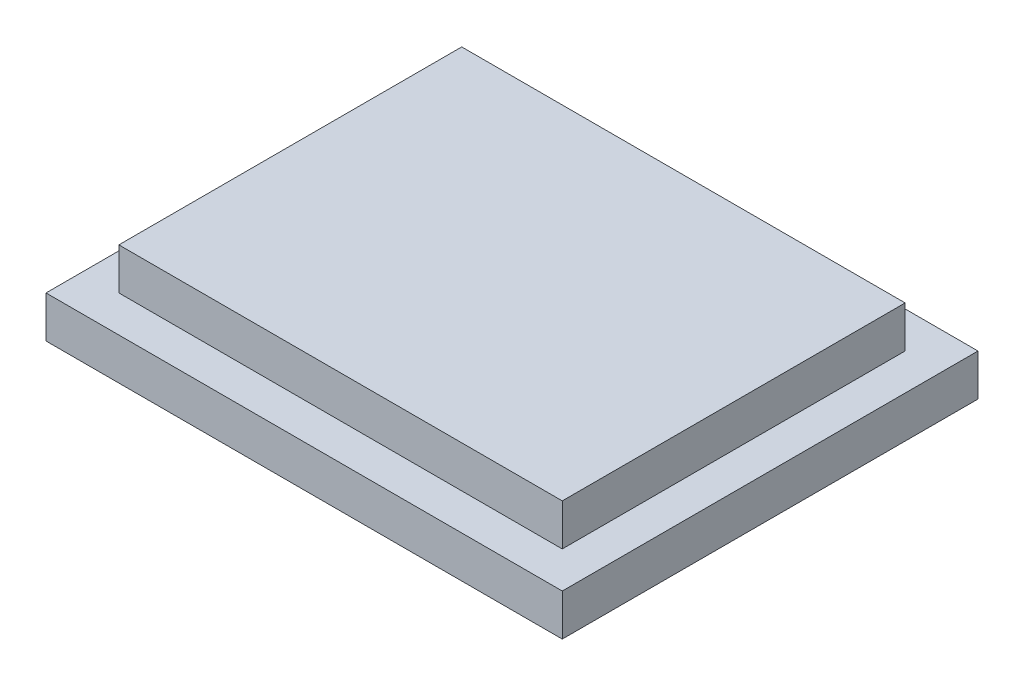
ISO-10303-21;
HEADER;
FILE_DESCRIPTION(('STEP AP214'),'2;1');
FILE_NAME('part.step','',(''),(''),'','','');
FILE_SCHEMA(('AUTOMOTIVE_DESIGN { 1 0 10303 214 1 1 1 1 }'));
ENDSEC;
DATA;
#1=APPLICATION_CONTEXT('core data for automotive mechanical design processes');
#2=APPLICATION_PROTOCOL_DEFINITION('international standard','automotive_design',2000,#1);
#3=PRODUCT_CONTEXT('',#1,'mechanical');
#4=PRODUCT('Part','Part','',(#3));
#5=PRODUCT_RELATED_PRODUCT_CATEGORY('part','',(#4));
#6=PRODUCT_DEFINITION_FORMATION('','',#4);
#7=PRODUCT_DEFINITION_CONTEXT('part definition',#1,'design');
#8=PRODUCT_DEFINITION('design','',#6,#7);
#9=PRODUCT_DEFINITION_SHAPE('','',#8);
#10=(LENGTH_UNIT() NAMED_UNIT(*) SI_UNIT(.MILLI.,.METRE.));
#11=(NAMED_UNIT(*) PLANE_ANGLE_UNIT() SI_UNIT($,.RADIAN.));
#12=(NAMED_UNIT(*) SI_UNIT($,.STERADIAN.) SOLID_ANGLE_UNIT());
#13=UNCERTAINTY_MEASURE_WITH_UNIT(LENGTH_MEASURE(1.E-05),#10,'distance_accuracy_value','');
#14=(GEOMETRIC_REPRESENTATION_CONTEXT(3) GLOBAL_UNCERTAINTY_ASSIGNED_CONTEXT((#13)) GLOBAL_UNIT_ASSIGNED_CONTEXT((#10,
#11,#12)) REPRESENTATION_CONTEXT('',''));
#15=CARTESIAN_POINT('',(0.,0.,0.));
#16=DIRECTION('',(0.,0.,1.));
#17=DIRECTION('',(1.,0.,0.));
#18=AXIS2_PLACEMENT_3D('',#15,#16,#17);
#19=CARTESIAN_POINT('',(0.,2.,0.));
#20=DIRECTION('',(0.,-1.,0.));
#21=DIRECTION('',(0.,0.,-1.));
#22=AXIS2_PLACEMENT_3D('',#19,#20,#21);
#23=PLANE('',#22);
#24=DIRECTION('',(0.,0.,1.));
#25=VECTOR('',#24,1.);
#26=CARTESIAN_POINT('',(0.,2.,0.));
#27=LINE('',#26,#25);
#28=CARTESIAN_POINT('',(0.,2.,-19.97));
#29=VERTEX_POINT('',#28);
#30=CARTESIAN_POINT('',(0.,2.,0.));
#31=VERTEX_POINT('',#30);
#32=EDGE_CURVE('E144',#29,#31,#27,.T.);
#33=ORIENTED_EDGE('',*,*,#32,.T.);
#34=DIRECTION('',(1.,0.,0.));
#35=VECTOR('',#34,1.);
#36=CARTESIAN_POINT('',(0.,2.,0.));
#37=LINE('',#36,#35);
#38=CARTESIAN_POINT('',(24.8,2.,0.));
#39=VERTEX_POINT('',#38);
#40=EDGE_CURVE('E146',#31,#39,#37,.T.);
#41=ORIENTED_EDGE('',*,*,#40,.T.);
#42=DIRECTION('',(0.,0.,-1.));
#43=VECTOR('',#42,1.);
#44=CARTESIAN_POINT('',(24.8,2.,0.));
#45=LINE('',#44,#43);
#46=CARTESIAN_POINT('',(24.8,2.,-19.97));
#47=VERTEX_POINT('',#46);
#48=EDGE_CURVE('E151',#39,#47,#45,.T.);
#49=ORIENTED_EDGE('',*,*,#48,.T.);
#50=DIRECTION('',(-1.,0.,0.));
#51=VECTOR('',#50,1.);
#52=CARTESIAN_POINT('',(0.,2.,-19.97));
#53=LINE('',#52,#51);
#54=EDGE_CURVE('E157',#47,#29,#53,.T.);
#55=ORIENTED_EDGE('',*,*,#54,.T.);
#56=EDGE_LOOP('',(#33,#41,#49,#55));
#57=FACE_BOUND('',#56,.T.);
#58=DIRECTION('',(-1.,0.,0.));
#59=VECTOR('',#58,1.);
#60=CARTESIAN_POINT('',(23.05,2.,-18.22));
#61=LINE('',#60,#59);
#62=CARTESIAN_POINT('',(23.05,2.,-18.22));
#63=VERTEX_POINT('',#62);
#64=CARTESIAN_POINT('',(1.75,2.,-18.22));
#65=VERTEX_POINT('',#64);
#66=EDGE_CURVE('E63',#63,#65,#61,.T.);
#67=ORIENTED_EDGE('',*,*,#66,.F.);
#68=DIRECTION('',(0.,0.,-1.));
#69=VECTOR('',#68,1.);
#70=CARTESIAN_POINT('',(23.05,2.,-1.75));
#71=LINE('',#70,#69);
#72=CARTESIAN_POINT('',(23.05,2.,-1.75));
#73=VERTEX_POINT('',#72);
#74=EDGE_CURVE('E64',#73,#63,#71,.T.);
#75=ORIENTED_EDGE('',*,*,#74,.F.);
#76=DIRECTION('',(1.,0.,0.));
#77=VECTOR('',#76,1.);
#78=CARTESIAN_POINT('',(1.75,2.,-1.75));
#79=LINE('',#78,#77);
#80=CARTESIAN_POINT('',(1.75,2.,-1.75));
#81=VERTEX_POINT('',#80);
#82=EDGE_CURVE('E272',#81,#73,#79,.T.);
#83=ORIENTED_EDGE('',*,*,#82,.F.);
#84=DIRECTION('',(0.,0.,1.));
#85=VECTOR('',#84,1.);
#86=CARTESIAN_POINT('',(1.75,2.,-18.22));
#87=LINE('',#86,#85);
#88=EDGE_CURVE('E281',#65,#81,#87,.T.);
#89=ORIENTED_EDGE('',*,*,#88,.F.);
#90=EDGE_LOOP('',(#67,#75,#83,#89));
#91=FACE_BOUND('',#90,.T.);
#92=ADVANCED_FACE('F44',(#57,#91),#23,.F.);
#93=CARTESIAN_POINT('',(0.,2.,0.));
#94=DIRECTION('',(1.,0.,0.));
#95=DIRECTION('',(0.,0.,-1.));
#96=AXIS2_PLACEMENT_3D('',#93,#94,#95);
#97=PLANE('',#96);
#98=DIRECTION('',(0.,0.,1.));
#99=VECTOR('',#98,1.);
#100=CARTESIAN_POINT('',(0.,0.,0.));
#101=LINE('',#100,#99);
#102=CARTESIAN_POINT('',(0.,0.,-19.97));
#103=VERTEX_POINT('',#102);
#104=CARTESIAN_POINT('',(0.,0.,0.));
#105=VERTEX_POINT('',#104);
#106=EDGE_CURVE('E132',#103,#105,#101,.T.);
#107=ORIENTED_EDGE('',*,*,#106,.T.);
#108=DIRECTION('',(0.,-1.,0.));
#109=VECTOR('',#108,1.);
#110=CARTESIAN_POINT('',(0.,2.,0.));
#111=LINE('',#110,#109);
#112=EDGE_CURVE('E11',#31,#105,#111,.T.);
#113=ORIENTED_EDGE('',*,*,#112,.F.);
#114=ORIENTED_EDGE('',*,*,#32,.F.);
#115=DIRECTION('',(0.,-1.,0.));
#116=VECTOR('',#115,1.);
#117=CARTESIAN_POINT('',(0.,2.,-19.97));
#118=LINE('',#117,#116);
#119=EDGE_CURVE('E156',#29,#103,#118,.T.);
#120=ORIENTED_EDGE('',*,*,#119,.T.);
#121=EDGE_LOOP('',(#107,#113,#114,#120));
#122=FACE_BOUND('',#121,.T.);
#123=ADVANCED_FACE('F50',(#122),#97,.F.);
#124=CARTESIAN_POINT('',(0.,2.,0.));
#125=DIRECTION('',(0.,0.,-1.));
#126=DIRECTION('',(-1.,0.,0.));
#127=AXIS2_PLACEMENT_3D('',#124,#125,#126);
#128=PLANE('',#127);
#129=DIRECTION('',(1.,0.,0.));
#130=VECTOR('',#129,1.);
#131=CARTESIAN_POINT('',(0.,0.,0.));
#132=LINE('',#131,#130);
#133=CARTESIAN_POINT('',(24.8,0.,0.));
#134=VERTEX_POINT('',#133);
#135=EDGE_CURVE('E137',#105,#134,#132,.T.);
#136=ORIENTED_EDGE('',*,*,#135,.T.);
#137=DIRECTION('',(0.,-1.,0.));
#138=VECTOR('',#137,1.);
#139=CARTESIAN_POINT('',(24.8,2.,0.));
#140=LINE('',#139,#138);
#141=EDGE_CURVE('E53',#39,#134,#140,.T.);
#142=ORIENTED_EDGE('',*,*,#141,.F.);
#143=ORIENTED_EDGE('',*,*,#40,.F.);
#144=ORIENTED_EDGE('',*,*,#112,.T.);
#145=EDGE_LOOP('',(#136,#142,#143,#144));
#146=FACE_BOUND('',#145,.T.);
#147=ADVANCED_FACE('F191',(#146),#128,.F.);
#148=CARTESIAN_POINT('',(24.8,2.,0.));
#149=DIRECTION('',(-1.,0.,0.));
#150=DIRECTION('',(0.,0.,1.));
#151=AXIS2_PLACEMENT_3D('',#148,#149,#150);
#152=PLANE('',#151);
#153=DIRECTION('',(0.,0.,-1.));
#154=VECTOR('',#153,1.);
#155=CARTESIAN_POINT('',(24.8,0.,0.));
#156=LINE('',#155,#154);
#157=CARTESIAN_POINT('',(24.8,0.,-19.97));
#158=VERTEX_POINT('',#157);
#159=EDGE_CURVE('E165',#134,#158,#156,.T.);
#160=ORIENTED_EDGE('',*,*,#159,.T.);
#161=DIRECTION('',(0.,-1.,0.));
#162=VECTOR('',#161,1.);
#163=CARTESIAN_POINT('',(24.8,2.,-19.97));
#164=LINE('',#163,#162);
#165=EDGE_CURVE('E169',#47,#158,#164,.T.);
#166=ORIENTED_EDGE('',*,*,#165,.F.);
#167=ORIENTED_EDGE('',*,*,#48,.F.);
#168=ORIENTED_EDGE('',*,*,#141,.T.);
#169=EDGE_LOOP('',(#160,#166,#167,#168));
#170=FACE_BOUND('',#169,.T.);
#171=ADVANCED_FACE('F177',(#170),#152,.F.);
#172=CARTESIAN_POINT('',(0.,2.,-19.97));
#173=DIRECTION('',(0.,0.,1.));
#174=DIRECTION('',(1.,0.,0.));
#175=AXIS2_PLACEMENT_3D('',#172,#173,#174);
#176=PLANE('',#175);
#177=DIRECTION('',(-1.,0.,0.));
#178=VECTOR('',#177,1.);
#179=CARTESIAN_POINT('',(0.,0.,-19.97));
#180=LINE('',#179,#178);
#181=EDGE_CURVE('E148',#158,#103,#180,.T.);
#182=ORIENTED_EDGE('',*,*,#181,.T.);
#183=ORIENTED_EDGE('',*,*,#119,.F.);
#184=ORIENTED_EDGE('',*,*,#54,.F.);
#185=ORIENTED_EDGE('',*,*,#165,.T.);
#186=EDGE_LOOP('',(#182,#183,#184,#185));
#187=FACE_BOUND('',#186,.T.);
#188=ADVANCED_FACE('F187',(#187),#176,.F.);
#189=CARTESIAN_POINT('',(0.,0.,0.));
#190=DIRECTION('',(0.,-1.,0.));
#191=DIRECTION('',(0.,0.,-1.));
#192=AXIS2_PLACEMENT_3D('',#189,#190,#191);
#193=PLANE('',#192);
#194=ORIENTED_EDGE('',*,*,#106,.F.);
#195=ORIENTED_EDGE('',*,*,#181,.F.);
#196=ORIENTED_EDGE('',*,*,#159,.F.);
#197=ORIENTED_EDGE('',*,*,#135,.F.);
#198=EDGE_LOOP('',(#194,#195,#196,#197));
#199=FACE_BOUND('',#198,.T.);
#200=ADVANCED_FACE('F184',(#199),#193,.T.);
#201=CARTESIAN_POINT('',(23.05,4.,-18.22));
#202=DIRECTION('',(0.,0.,1.));
#203=DIRECTION('',(1.,0.,0.));
#204=AXIS2_PLACEMENT_3D('',#201,#202,#203);
#205=PLANE('',#204);
#206=ORIENTED_EDGE('',*,*,#66,.T.);
#207=DIRECTION('',(0.,-1.,0.));
#208=VECTOR('',#207,1.);
#209=CARTESIAN_POINT('',(1.75,4.,-18.22));
#210=LINE('',#209,#208);
#211=CARTESIAN_POINT('',(1.75,4.,-18.22));
#212=VERTEX_POINT('',#211);
#213=EDGE_CURVE('E114',#212,#65,#210,.T.);
#214=ORIENTED_EDGE('',*,*,#213,.F.);
#215=DIRECTION('',(-1.,0.,0.));
#216=VECTOR('',#215,1.);
#217=CARTESIAN_POINT('',(23.05,4.,-18.22));
#218=LINE('',#217,#216);
#219=CARTESIAN_POINT('',(23.05,4.,-18.22));
#220=VERTEX_POINT('',#219);
#221=EDGE_CURVE('E123',#220,#212,#218,.T.);
#222=ORIENTED_EDGE('',*,*,#221,.F.);
#223=DIRECTION('',(0.,-1.,0.));
#224=VECTOR('',#223,1.);
#225=CARTESIAN_POINT('',(23.05,4.,-18.22));
#226=LINE('',#225,#224);
#227=EDGE_CURVE('E271',#220,#63,#226,.T.);
#228=ORIENTED_EDGE('',*,*,#227,.T.);
#229=EDGE_LOOP('',(#206,#214,#222,#228));
#230=FACE_BOUND('',#229,.T.);
#231=ADVANCED_FACE('F135',(#230),#205,.F.);
#232=CARTESIAN_POINT('',(1.75,4.,-18.22));
#233=DIRECTION('',(1.,0.,0.));
#234=DIRECTION('',(0.,0.,-1.));
#235=AXIS2_PLACEMENT_3D('',#232,#233,#234);
#236=PLANE('',#235);
#237=ORIENTED_EDGE('',*,*,#88,.T.);
#238=DIRECTION('',(0.,-1.,0.));
#239=VECTOR('',#238,1.);
#240=CARTESIAN_POINT('',(1.75,4.,-1.75));
#241=LINE('',#240,#239);
#242=CARTESIAN_POINT('',(1.75,4.,-1.75));
#243=VERTEX_POINT('',#242);
#244=EDGE_CURVE('E118',#243,#81,#241,.T.);
#245=ORIENTED_EDGE('',*,*,#244,.F.);
#246=DIRECTION('',(0.,0.,1.));
#247=VECTOR('',#246,1.);
#248=CARTESIAN_POINT('',(1.75,4.,-18.22));
#249=LINE('',#248,#247);
#250=EDGE_CURVE('E107',#212,#243,#249,.T.);
#251=ORIENTED_EDGE('',*,*,#250,.F.);
#252=ORIENTED_EDGE('',*,*,#213,.T.);
#253=EDGE_LOOP('',(#237,#245,#251,#252));
#254=FACE_BOUND('',#253,.T.);
#255=ADVANCED_FACE('F115',(#254),#236,.F.);
#256=CARTESIAN_POINT('',(1.75,4.,-1.75));
#257=DIRECTION('',(0.,0.,-1.));
#258=DIRECTION('',(-1.,0.,0.));
#259=AXIS2_PLACEMENT_3D('',#256,#257,#258);
#260=PLANE('',#259);
#261=ORIENTED_EDGE('',*,*,#82,.T.);
#262=DIRECTION('',(0.,-1.,0.));
#263=VECTOR('',#262,1.);
#264=CARTESIAN_POINT('',(23.05,4.,-1.75));
#265=LINE('',#264,#263);
#266=CARTESIAN_POINT('',(23.05,4.,-1.75));
#267=VERTEX_POINT('',#266);
#268=EDGE_CURVE('E141',#267,#73,#265,.T.);
#269=ORIENTED_EDGE('',*,*,#268,.F.);
#270=DIRECTION('',(1.,0.,0.));
#271=VECTOR('',#270,1.);
#272=CARTESIAN_POINT('',(1.75,4.,-1.75));
#273=LINE('',#272,#271);
#274=EDGE_CURVE('E119',#243,#267,#273,.T.);
#275=ORIENTED_EDGE('',*,*,#274,.F.);
#276=ORIENTED_EDGE('',*,*,#244,.T.);
#277=EDGE_LOOP('',(#261,#269,#275,#276));
#278=FACE_BOUND('',#277,.T.);
#279=ADVANCED_FACE('F243',(#278),#260,.F.);
#280=CARTESIAN_POINT('',(23.05,4.,-1.75));
#281=DIRECTION('',(-1.,0.,0.));
#282=DIRECTION('',(0.,0.,1.));
#283=AXIS2_PLACEMENT_3D('',#280,#281,#282);
#284=PLANE('',#283);
#285=ORIENTED_EDGE('',*,*,#74,.T.);
#286=ORIENTED_EDGE('',*,*,#227,.F.);
#287=DIRECTION('',(0.,0.,-1.));
#288=VECTOR('',#287,1.);
#289=CARTESIAN_POINT('',(23.05,4.,-1.75));
#290=LINE('',#289,#288);
#291=EDGE_CURVE('E128',#267,#220,#290,.T.);
#292=ORIENTED_EDGE('',*,*,#291,.F.);
#293=ORIENTED_EDGE('',*,*,#268,.T.);
#294=EDGE_LOOP('',(#285,#286,#292,#293));
#295=FACE_BOUND('',#294,.T.);
#296=ADVANCED_FACE('F249',(#295),#284,.F.);
#297=CARTESIAN_POINT('',(0.,4.,0.));
#298=DIRECTION('',(0.,1.,0.));
#299=DIRECTION('',(0.,0.,1.));
#300=AXIS2_PLACEMENT_3D('',#297,#298,#299);
#301=PLANE('',#300);
#302=ORIENTED_EDGE('',*,*,#221,.T.);
#303=ORIENTED_EDGE('',*,*,#250,.T.);
#304=ORIENTED_EDGE('',*,*,#274,.T.);
#305=ORIENTED_EDGE('',*,*,#291,.T.);
#306=EDGE_LOOP('',(#302,#303,#304,#305));
#307=FACE_BOUND('',#306,.T.);
#308=ADVANCED_FACE('F125',(#307),#301,.T.);
#309=CLOSED_SHELL('',(#92,#123,#147,#171,#188,#200,#231,#255,#279,#296,#308));
#310=MANIFOLD_SOLID_BREP('B2',#309);
#311=ADVANCED_BREP_SHAPE_REPRESENTATION('',(#18,#310),#14);
#312=SHAPE_DEFINITION_REPRESENTATION(#9,#311);
ENDSEC;
END-ISO-10303-21;
